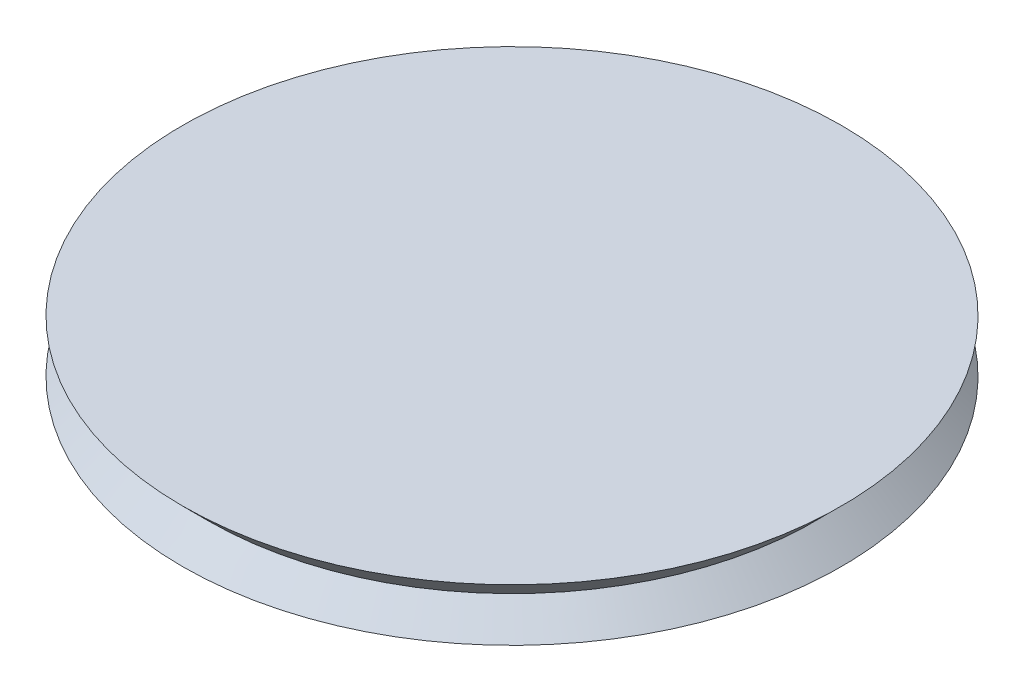
ISO-10303-21;
HEADER;
FILE_DESCRIPTION(('STEP AP214'),'2;1');
FILE_NAME('part.step','',(''),(''),'','','');
FILE_SCHEMA(('AUTOMOTIVE_DESIGN { 1 0 10303 214 1 1 1 1 }'));
ENDSEC;
DATA;
#1=APPLICATION_CONTEXT('core data for automotive mechanical design processes');
#2=APPLICATION_PROTOCOL_DEFINITION('international standard','automotive_design',2000,#1);
#3=PRODUCT_CONTEXT('',#1,'mechanical');
#4=PRODUCT('Part','Part','',(#3));
#5=PRODUCT_RELATED_PRODUCT_CATEGORY('part','',(#4));
#6=PRODUCT_DEFINITION_FORMATION('','',#4);
#7=PRODUCT_DEFINITION_CONTEXT('part definition',#1,'design');
#8=PRODUCT_DEFINITION('design','',#6,#7);
#9=PRODUCT_DEFINITION_SHAPE('','',#8);
#10=(LENGTH_UNIT() NAMED_UNIT(*) SI_UNIT(.MILLI.,.METRE.));
#11=(NAMED_UNIT(*) PLANE_ANGLE_UNIT() SI_UNIT($,.RADIAN.));
#12=(NAMED_UNIT(*) SI_UNIT($,.STERADIAN.) SOLID_ANGLE_UNIT());
#13=UNCERTAINTY_MEASURE_WITH_UNIT(LENGTH_MEASURE(1.E-05),#10,'distance_accuracy_value','');
#14=(GEOMETRIC_REPRESENTATION_CONTEXT(3) GLOBAL_UNCERTAINTY_ASSIGNED_CONTEXT((#13)) GLOBAL_UNIT_ASSIGNED_CONTEXT((#10,
#11,#12)) REPRESENTATION_CONTEXT('',''));
#15=CARTESIAN_POINT('',(0.,0.,0.));
#16=DIRECTION('',(0.,0.,1.));
#17=DIRECTION('',(1.,0.,0.));
#18=AXIS2_PLACEMENT_3D('',#15,#16,#17);
#19=CARTESIAN_POINT('',(0.,7.4,0.));
#20=DIRECTION('',(0.,1.,0.));
#21=DIRECTION('',(0.,0.,1.));
#22=AXIS2_PLACEMENT_3D('',#19,#20,#21);
#23=PLANE('',#22);
#24=CARTESIAN_POINT('',(0.,7.4,0.));
#25=DIRECTION('',(0.,1.,0.));
#26=DIRECTION('',(0.,0.,1.));
#27=AXIS2_PLACEMENT_3D('',#24,#25,#26);
#28=CIRCLE('',#27,7.1);
#29=CARTESIAN_POINT('',(0.,7.4,7.1));
#30=VERTEX_POINT('',#29);
#31=CARTESIAN_POINT('',(0.,7.4,-7.1));
#32=VERTEX_POINT('',#31);
#33=EDGE_CURVE('E304',#30,#32,#28,.T.);
#34=ORIENTED_EDGE('',*,*,#33,.T.);
#35=DIRECTION('',(-1.,0.,0.));
#36=VECTOR('',#35,1.);
#37=CARTESIAN_POINT('',(-6.1,7.4,-7.1));
#38=LINE('',#37,#36);
#39=CARTESIAN_POINT('',(-7.1,7.4,-7.1));
#40=VERTEX_POINT('',#39);
#41=EDGE_CURVE('E255',#32,#40,#38,.T.);
#42=ORIENTED_EDGE('',*,*,#41,.T.);
#43=DIRECTION('',(0.,0.,1.));
#44=VECTOR('',#43,1.);
#45=CARTESIAN_POINT('',(-7.1,7.4,6.1));
#46=LINE('',#45,#44);
#47=CARTESIAN_POINT('',(-7.1,7.4,7.1));
#48=VERTEX_POINT('',#47);
#49=EDGE_CURVE('E260',#40,#48,#46,.T.);
#50=ORIENTED_EDGE('',*,*,#49,.T.);
#51=DIRECTION('',(1.,0.,0.));
#52=VECTOR('',#51,1.);
#53=CARTESIAN_POINT('',(0.,7.4,7.1));
#54=LINE('',#53,#52);
#55=EDGE_CURVE('E114',#48,#30,#54,.T.);
#56=ORIENTED_EDGE('',*,*,#55,.T.);
#57=EDGE_LOOP('',(#34,#42,#50,#56));
#58=FACE_BOUND('',#57,.T.);
#59=CARTESIAN_POINT('',(0.,7.4,0.));
#60=DIRECTION('',(0.,-1.,0.));
#61=DIRECTION('',(0.,0.,-1.));
#62=AXIS2_PLACEMENT_3D('',#59,#60,#61);
#63=CIRCLE('',#62,50.225);
#64=CARTESIAN_POINT('',(0.,7.4,-50.225));
#65=VERTEX_POINT('',#64);
#66=EDGE_CURVE('E209',#65,#65,#63,.T.);
#67=ORIENTED_EDGE('',*,*,#66,.T.);
#68=EDGE_LOOP('',(#67));
#69=FACE_BOUND('',#68,.T.);
#70=ADVANCED_FACE('F41',(#58,#69),#23,.F.);
#71=CARTESIAN_POINT('',(0.,7.4,0.));
#72=DIRECTION('',(0.,-1.,0.));
#73=DIRECTION('',(0.,0.,-1.));
#74=AXIS2_PLACEMENT_3D('',#71,#72,#73);
#75=CYLINDRICAL_SURFACE('',#74,1.6);
#76=CARTESIAN_POINT('',(0.,7.4,0.));
#77=DIRECTION('',(0.,1.,0.));
#78=DIRECTION('',(0.,0.,1.));
#79=AXIS2_PLACEMENT_3D('',#76,#77,#78);
#80=CIRCLE('',#79,1.6);
#81=CARTESIAN_POINT('',(0.,7.4,1.6));
#82=VERTEX_POINT('',#81);
#83=EDGE_CURVE('E202',#82,#82,#80,.T.);
#84=ORIENTED_EDGE('',*,*,#83,.T.);
#85=EDGE_LOOP('',(#84));
#86=FACE_BOUND('',#85,.T.);
#87=CARTESIAN_POINT('',(0.,0.,0.));
#88=DIRECTION('',(0.,1.,0.));
#89=DIRECTION('',(0.,0.,1.));
#90=AXIS2_PLACEMENT_3D('',#87,#88,#89);
#91=CIRCLE('',#90,1.6);
#92=CARTESIAN_POINT('',(0.,0.,1.6));
#93=VERTEX_POINT('',#92);
#94=EDGE_CURVE('E214',#93,#93,#91,.T.);
#95=ORIENTED_EDGE('',*,*,#94,.F.);
#96=EDGE_LOOP('',(#95));
#97=FACE_BOUND('',#96,.T.);
#98=CARTESIAN_POINT('',(-1.1,3.99999999999999,-1.16189500386223));
#99=CARTESIAN_POINT('',(-1.10927031182656,4.03397480461144,-1.15311843130079));
#100=CARTESIAN_POINT('',(-1.11978040861949,4.06718834312701,-1.14295833429883));
#101=CARTESIAN_POINT('',(-1.14266755873094,4.13198047739514,-1.12007705966408));
#102=CARTESIAN_POINT('',(-1.15504094344651,4.1635621255794,-1.10736089851463));
#103=CARTESIAN_POINT('',(-1.1940207421072,4.25568899661757,-1.06571489176433));
#104=CARTESIAN_POINT('',(-1.2225531678548,4.313832380025,-1.03322940633927));
#105=CARTESIAN_POINT('',(-1.28090842097074,4.4230745443434,-0.959928900256689));
#106=CARTESIAN_POINT('',(-1.31072115920425,4.47421852161003,-0.919171996773916));
#107=CARTESIAN_POINT('',(-1.36924824799041,4.56962940814286,-0.829474329978252));
#108=CARTESIAN_POINT('',(-1.39796183632632,4.61389160803624,-0.780528009584058));
#109=CARTESIAN_POINT('',(-1.44961779705837,4.69102760835938,-0.679374813049439));
#110=CARTESIAN_POINT('',(-1.47284446373623,4.7245549833571,-0.627815132803611));
#111=CARTESIAN_POINT('',(-1.51470893289596,4.78387459829417,-0.518712108435694));
#112=CARTESIAN_POINT('',(-1.53335065097024,4.80967344261101,-0.461173930174292));
#113=CARTESIAN_POINT('',(-1.56455961116192,4.85241586073261,-0.340669075193646));
#114=CARTESIAN_POINT('',(-1.57707145356655,4.86927878227095,-0.27765873853739));
#115=CARTESIAN_POINT('',(-1.5943960113471,4.89254379281133,-0.148714517438342));
#116=CARTESIAN_POINT('',(-1.59921656399652,4.89895653048842,-0.0827836794491256));
#117=CARTESIAN_POINT('',(-1.6005059172847,4.90067360291498,0.039587455194473));
#118=CARTESIAN_POINT('',(-1.59809545470662,4.8974685714058,0.0960021495849242));
#119=CARTESIAN_POINT('',(-1.58749994129544,4.88329139695343,0.207283150147398));
#120=CARTESIAN_POINT('',(-1.57931465947015,4.87231894331404,0.262149394290258));
#121=CARTESIAN_POINT('',(-1.55810141552651,4.84357822868422,0.367629711953085));
#122=CARTESIAN_POINT('',(-1.54519038321169,4.82597377958391,0.41831296140437));
#123=CARTESIAN_POINT('',(-1.51540944219095,4.78474359072693,0.515886540372598));
#124=CARTESIAN_POINT('',(-1.49853935735389,4.7611175830779,0.562776701016992));
#125=CARTESIAN_POINT('',(-1.45934977136649,4.70506611099741,0.658261509094108));
#126=CARTESIAN_POINT('',(-1.4366022015524,4.67188369632804,0.706233461367265));
#127=CARTESIAN_POINT('',(-1.38872747445747,4.59960976604622,0.796268532952846));
#128=CARTESIAN_POINT('',(-1.36359587985746,4.56050714741511,0.8383202570274));
#129=CARTESIAN_POINT('',(-1.3073619732146,4.46862280359901,0.924084483108964));
#130=CARTESIAN_POINT('',(-1.27607643854298,4.41467213191052,0.966426158688031));
#131=CARTESIAN_POINT('',(-1.21543810394053,4.299726856543,1.04164639134407));
#132=CARTESIAN_POINT('',(-1.18607963585927,4.23875451133708,1.07455375723116));
#133=CARTESIAN_POINT('',(-1.148381152763,4.14655916680762,1.11422508764565));
#134=CARTESIAN_POINT('',(-1.13758030126083,4.1181285725016,1.12521642122674));
#135=CARTESIAN_POINT('',(-1.11752151157456,4.06000007276428,1.14513945648254));
#136=CARTESIAN_POINT('',(-1.10826504720439,4.03030099036651,1.15406919385151));
#137=CARTESIAN_POINT('',(-1.1,4.00000000000001,1.16189500386223));
#138=B_SPLINE_CURVE_WITH_KNOTS('',3,(#98,#99,#100,#101,#102,#103,#104,#105,#106,#107,#108,#109,
#110,#111,#112,#113,#114,#115,#116,#117,#118,#119,#120,#121,#122,#123,#124,#125,#126,#127,#128,
#129,#130,#131,#132,#133,#134,#135,#136,#137),.UNSPECIFIED.,.F.,.F.,(4,2,2,2,2,2,2,2,2,2,2,2,2,
2,2,2,2,2,2,4),(0.,0.108730962624511,0.217250579592953,0.433599624581697,0.648478132284191,
0.863503045588987,1.05994794301119,1.25622448738958,1.45424361157122,1.65206082898484,
1.82087886528617,1.98970365467538,2.1546060852408,2.31951585341063,2.50666174474359,
2.69416306814262,2.91942233145523,3.14398622771513,3.24089054971267,3.33788682535342),.UNSPECIFIED.);
#139=CARTESIAN_POINT('',(-1.1,3.99999999999999,-1.16189500386223));
#140=VERTEX_POINT('',#139);
#141=CARTESIAN_POINT('',(-1.1,4.00000000000001,1.16189500386223));
#142=VERTEX_POINT('',#141);
#143=EDGE_CURVE('E122',#140,#142,#138,.T.);
#144=ORIENTED_EDGE('',*,*,#143,.F.);
#145=DIRECTION('',(0.,-1.,0.));
#146=VECTOR('',#145,1.);
#147=CARTESIAN_POINT('',(-1.1,7.4,-1.16189500386223));
#148=LINE('',#147,#146);
#149=CARTESIAN_POINT('',(-1.1,3.40000000000001,-1.16189500386223));
#150=VERTEX_POINT('',#149);
#151=EDGE_CURVE('E107',#140,#150,#148,.T.);
#152=ORIENTED_EDGE('',*,*,#151,.T.);
#153=CARTESIAN_POINT('',(-1.1,3.39999999999999,1.16189500386223));
#154=CARTESIAN_POINT('',(-1.10927031182656,3.36602519538854,1.15311843130079));
#155=CARTESIAN_POINT('',(-1.11978040861949,3.33281165687298,1.14295833429883));
#156=CARTESIAN_POINT('',(-1.14266755873094,3.26801952260484,1.12007705966408));
#157=CARTESIAN_POINT('',(-1.15504094344652,3.23643787442059,1.10736089851462));
#158=CARTESIAN_POINT('',(-1.19402074210721,3.14431100338242,1.06571489176433));
#159=CARTESIAN_POINT('',(-1.22255316785481,3.08616761997498,1.03322940633927));
#160=CARTESIAN_POINT('',(-1.28090842097074,2.97692545565658,0.959928900256681));
#161=CARTESIAN_POINT('',(-1.31072115920426,2.92578147838995,0.919171996773906));
#162=CARTESIAN_POINT('',(-1.36924824799042,2.83037059185712,0.829474329978238));
#163=CARTESIAN_POINT('',(-1.39796183632633,2.78610839196374,0.780528009584043));
#164=CARTESIAN_POINT('',(-1.44961779705837,2.7089723916406,0.679374813049422));
#165=CARTESIAN_POINT('',(-1.47284446373623,2.67544501664289,0.627815132803594));
#166=CARTESIAN_POINT('',(-1.51470893289596,2.61612540170582,0.518712108435677));
#167=CARTESIAN_POINT('',(-1.53335065097024,2.59032655738898,0.461173930174275));
#168=CARTESIAN_POINT('',(-1.56455961116193,2.54758413926739,0.340669075193629));
#169=CARTESIAN_POINT('',(-1.57707145356655,2.53072121772905,0.277658738537374));
#170=CARTESIAN_POINT('',(-1.5943960113471,2.50745620718866,0.148714517438326));
#171=CARTESIAN_POINT('',(-1.59921656399652,2.50104346951158,0.0827836794491105));
#172=CARTESIAN_POINT('',(-1.6005059172847,2.49932639708502,-0.0395874551944871));
#173=CARTESIAN_POINT('',(-1.59809545470661,2.5025314285942,-0.0960021495849378));
#174=CARTESIAN_POINT('',(-1.58749994129544,2.51670860304658,-0.207283150147411));
#175=CARTESIAN_POINT('',(-1.57931465947015,2.52768105668596,-0.26214939429027));
#176=CARTESIAN_POINT('',(-1.55810141552651,2.55642177131578,-0.367629711953097));
#177=CARTESIAN_POINT('',(-1.54519038321168,2.57402622041609,-0.418312961404381));
#178=CARTESIAN_POINT('',(-1.51540944219094,2.61525640927308,-0.515886540372609));
#179=CARTESIAN_POINT('',(-1.49853935735388,2.63888241692211,-0.562776701017002));
#180=CARTESIAN_POINT('',(-1.45934977136649,2.6949338890026,-0.658261509094119));
#181=CARTESIAN_POINT('',(-1.4366022015524,2.72811630367197,-0.706233461367276));
#182=CARTESIAN_POINT('',(-1.38872747445746,2.80039023395379,-0.796268532952856));
#183=CARTESIAN_POINT('',(-1.36359587985746,2.8394928525849,-0.83832025702741));
#184=CARTESIAN_POINT('',(-1.30736197321459,2.931377196401,-0.924084483108972));
#185=CARTESIAN_POINT('',(-1.27607643854297,2.9853278680895,-0.966426158688039));
#186=CARTESIAN_POINT('',(-1.21543810394052,3.10027314345702,-1.04164639134407));
#187=CARTESIAN_POINT('',(-1.18607963585926,3.16124548866294,-1.07455375723117));
#188=CARTESIAN_POINT('',(-1.148381152763,3.2534408331924,-1.11422508764565));
#189=CARTESIAN_POINT('',(-1.13758030126082,3.28187142749842,-1.12521642122674));
#190=CARTESIAN_POINT('',(-1.11752151157456,3.33999992723574,-1.14513945648254));
#191=CARTESIAN_POINT('',(-1.10826504720439,3.36969900963351,-1.15406919385151));
#192=CARTESIAN_POINT('',(-1.1,3.40000000000001,-1.16189500386223));
#193=B_SPLINE_CURVE_WITH_KNOTS('',3,(#153,#154,#155,#156,#157,#158,#159,#160,#161,#162,#163,
#164,#165,#166,#167,#168,#169,#170,#171,#172,#173,#174,#175,#176,#177,#178,#179,#180,#181,#182,
#183,#184,#185,#186,#187,#188,#189,#190,#191,#192),.UNSPECIFIED.,.F.,.F.,(4,2,2,2,2,2,2,2,2,2,2,
2,2,2,2,2,2,2,2,4),(0.,0.108730962624511,0.217250579592955,0.433599624581702,0.648478132284199,
0.863503045588998,1.0599479430112,1.25622448738958,1.45424361157123,1.65206082898484,
1.82087886528617,1.98970365467538,2.1546060852408,2.31951585341064,2.50666174474359,
2.69416306814263,2.91942233145524,3.14398622771514,3.24089054971267,3.33788682535342),.UNSPECIFIED.);
#194=CARTESIAN_POINT('',(-1.1,3.39999999999999,1.16189500386223));
#195=VERTEX_POINT('',#194);
#196=EDGE_CURVE('E115',#195,#150,#193,.T.);
#197=ORIENTED_EDGE('',*,*,#196,.F.);
#198=DIRECTION('',(0.,-1.,0.));
#199=VECTOR('',#198,1.);
#200=CARTESIAN_POINT('',(-1.1,7.4,1.16189500386223));
#201=LINE('',#200,#199);
#202=EDGE_CURVE('E128',#195,#142,#201,.F.);
#203=ORIENTED_EDGE('',*,*,#202,.T.);
#204=EDGE_LOOP('',(#144,#152,#197,#203));
#205=FACE_BOUND('',#204,.T.);
#206=ADVANCED_FACE('F127',(#86,#97,#205),#75,.F.);
#207=CARTESIAN_POINT('',(0.,7.4,0.));
#208=DIRECTION('',(0.,-1.,0.));
#209=DIRECTION('',(0.,0.,-1.));
#210=AXIS2_PLACEMENT_3D('',#207,#208,#209);
#211=CYLINDRICAL_SURFACE('',#210,6.1);
#212=DIRECTION('',(0.,-1.,0.));
#213=VECTOR('',#212,1.);
#214=CARTESIAN_POINT('',(0.,7.4,-6.1));
#215=LINE('',#214,#213);
#216=CARTESIAN_POINT('',(0.,6.4,-6.1));
#217=VERTEX_POINT('',#216);
#218=CARTESIAN_POINT('',(0.,0.,-6.1));
#219=VERTEX_POINT('',#218);
#220=EDGE_CURVE('E131',#217,#219,#215,.T.);
#221=ORIENTED_EDGE('',*,*,#220,.F.);
#222=CARTESIAN_POINT('',(0.,6.4,0.));
#223=DIRECTION('',(0.,1.,0.));
#224=DIRECTION('',(0.,0.,1.));
#225=AXIS2_PLACEMENT_3D('',#222,#223,#224);
#226=CIRCLE('',#225,6.1);
#227=CARTESIAN_POINT('',(0.,6.4,6.1));
#228=VERTEX_POINT('',#227);
#229=EDGE_CURVE('E64',#217,#228,#226,.F.);
#230=ORIENTED_EDGE('',*,*,#229,.T.);
#231=DIRECTION('',(0.,-1.,0.));
#232=VECTOR('',#231,1.);
#233=CARTESIAN_POINT('',(0.,7.4,6.1));
#234=LINE('',#233,#232);
#235=CARTESIAN_POINT('',(0.,0.,6.1));
#236=VERTEX_POINT('',#235);
#237=EDGE_CURVE('E230',#228,#236,#234,.T.);
#238=ORIENTED_EDGE('',*,*,#237,.T.);
#239=CARTESIAN_POINT('',(0.,0.,0.));
#240=DIRECTION('',(0.,1.,0.));
#241=DIRECTION('',(0.,0.,1.));
#242=AXIS2_PLACEMENT_3D('',#239,#240,#241);
#243=CIRCLE('',#242,6.1);
#244=EDGE_CURVE('E217',#236,#219,#243,.T.);
#245=ORIENTED_EDGE('',*,*,#244,.T.);
#246=EDGE_LOOP('',(#221,#230,#238,#245));
#247=FACE_BOUND('',#246,.T.);
#248=ADVANCED_FACE('F175',(#247),#211,.T.);
#249=CARTESIAN_POINT('',(0.,7.4,-6.1));
#250=DIRECTION('',(0.,0.,1.));
#251=DIRECTION('',(1.,0.,0.));
#252=AXIS2_PLACEMENT_3D('',#249,#250,#251);
#253=PLANE('',#252);
#254=DIRECTION('',(0.,-1.,0.));
#255=VECTOR('',#254,1.);
#256=CARTESIAN_POINT('',(-6.1,7.4,-6.1));
#257=LINE('',#256,#255);
#258=CARTESIAN_POINT('',(-6.1,6.4,-6.1));
#259=VERTEX_POINT('',#258);
#260=CARTESIAN_POINT('',(-6.1,0.,-6.1));
#261=VERTEX_POINT('',#260);
#262=EDGE_CURVE('E234',#259,#261,#257,.T.);
#263=ORIENTED_EDGE('',*,*,#262,.F.);
#264=DIRECTION('',(-1.,0.,0.));
#265=VECTOR('',#264,1.);
#266=CARTESIAN_POINT('',(0.,6.4,-6.1));
#267=LINE('',#266,#265);
#268=EDGE_CURVE('E240',#259,#217,#267,.F.);
#269=ORIENTED_EDGE('',*,*,#268,.T.);
#270=ORIENTED_EDGE('',*,*,#220,.T.);
#271=DIRECTION('',(-1.,0.,0.));
#272=VECTOR('',#271,1.);
#273=CARTESIAN_POINT('',(0.,0.,-6.1));
#274=LINE('',#273,#272);
#275=EDGE_CURVE('E221',#219,#261,#274,.T.);
#276=ORIENTED_EDGE('',*,*,#275,.T.);
#277=EDGE_LOOP('',(#263,#269,#270,#276));
#278=FACE_BOUND('',#277,.T.);
#279=ADVANCED_FACE('F172',(#278),#253,.F.);
#280=CARTESIAN_POINT('',(-6.1,7.4,0.));
#281=DIRECTION('',(1.,0.,0.));
#282=DIRECTION('',(0.,0.,-1.));
#283=AXIS2_PLACEMENT_3D('',#280,#281,#282);
#284=PLANE('',#283);
#285=CARTESIAN_POINT('',(-6.1,3.7,0.));
#286=DIRECTION('',(-1.,0.,0.));
#287=DIRECTION('',(0.,0.,1.));
#288=AXIS2_PLACEMENT_3D('',#285,#286,#287);
#289=CIRCLE('',#288,1.8);
#290=CARTESIAN_POINT('',(-6.1,3.7,1.8));
#291=VERTEX_POINT('',#290);
#292=EDGE_CURVE('E124',#291,#291,#289,.T.);
#293=ORIENTED_EDGE('',*,*,#292,.F.);
#294=EDGE_LOOP('',(#293));
#295=FACE_BOUND('',#294,.T.);
#296=DIRECTION('',(0.,-1.,0.));
#297=VECTOR('',#296,1.);
#298=CARTESIAN_POINT('',(-6.1,7.4,6.1));
#299=LINE('',#298,#297);
#300=CARTESIAN_POINT('',(-6.1,6.4,6.1));
#301=VERTEX_POINT('',#300);
#302=CARTESIAN_POINT('',(-6.1,0.,6.1));
#303=VERTEX_POINT('',#302);
#304=EDGE_CURVE('E232',#301,#303,#299,.T.);
#305=ORIENTED_EDGE('',*,*,#304,.F.);
#306=DIRECTION('',(0.,0.,1.));
#307=VECTOR('',#306,1.);
#308=CARTESIAN_POINT('',(-6.1,6.4,-6.1));
#309=LINE('',#308,#307);
#310=EDGE_CURVE('E50',#301,#259,#309,.F.);
#311=ORIENTED_EDGE('',*,*,#310,.T.);
#312=ORIENTED_EDGE('',*,*,#262,.T.);
#313=DIRECTION('',(0.,0.,1.));
#314=VECTOR('',#313,1.);
#315=CARTESIAN_POINT('',(-6.1,0.,0.));
#316=LINE('',#315,#314);
#317=EDGE_CURVE('E224',#261,#303,#316,.T.);
#318=ORIENTED_EDGE('',*,*,#317,.T.);
#319=EDGE_LOOP('',(#305,#311,#312,#318));
#320=FACE_BOUND('',#319,.T.);
#321=ADVANCED_FACE('F169',(#295,#320),#284,.F.);
#322=CARTESIAN_POINT('',(0.,7.4,6.1));
#323=DIRECTION('',(0.,0.,-1.));
#324=DIRECTION('',(-1.,0.,0.));
#325=AXIS2_PLACEMENT_3D('',#322,#323,#324);
#326=PLANE('',#325);
#327=ORIENTED_EDGE('',*,*,#237,.F.);
#328=DIRECTION('',(1.,0.,0.));
#329=VECTOR('',#328,1.);
#330=CARTESIAN_POINT('',(-6.1,6.4,6.1));
#331=LINE('',#330,#329);
#332=EDGE_CURVE('E11',#228,#301,#331,.F.);
#333=ORIENTED_EDGE('',*,*,#332,.T.);
#334=ORIENTED_EDGE('',*,*,#304,.T.);
#335=DIRECTION('',(1.,0.,0.));
#336=VECTOR('',#335,1.);
#337=CARTESIAN_POINT('',(0.,0.,6.1));
#338=LINE('',#337,#336);
#339=EDGE_CURVE('E227',#303,#236,#338,.T.);
#340=ORIENTED_EDGE('',*,*,#339,.T.);
#341=EDGE_LOOP('',(#327,#333,#334,#340));
#342=FACE_BOUND('',#341,.T.);
#343=ADVANCED_FACE('F165',(#342),#326,.F.);
#344=CARTESIAN_POINT('',(0.,0.,0.));
#345=DIRECTION('',(0.,1.,0.));
#346=DIRECTION('',(0.,0.,1.));
#347=AXIS2_PLACEMENT_3D('',#344,#345,#346);
#348=PLANE('',#347);
#349=ORIENTED_EDGE('',*,*,#94,.T.);
#350=EDGE_LOOP('',(#349));
#351=FACE_BOUND('',#350,.T.);
#352=ORIENTED_EDGE('',*,*,#244,.F.);
#353=ORIENTED_EDGE('',*,*,#339,.F.);
#354=ORIENTED_EDGE('',*,*,#317,.F.);
#355=ORIENTED_EDGE('',*,*,#275,.F.);
#356=EDGE_LOOP('',(#352,#353,#354,#355));
#357=FACE_BOUND('',#356,.T.);
#358=ADVANCED_FACE('F161',(#351,#357),#348,.F.);
#359=CARTESIAN_POINT('',(-2.1,3.7,0.));
#360=DIRECTION('',(-1.,0.,0.));
#361=DIRECTION('',(0.,0.,1.));
#362=AXIS2_PLACEMENT_3D('',#359,#360,#361);
#363=CYLINDRICAL_SURFACE('',#362,1.8);
#364=CARTESIAN_POINT('',(-2.1,3.7,0.));
#365=DIRECTION('',(-1.,0.,0.));
#366=DIRECTION('',(0.,0.,1.));
#367=AXIS2_PLACEMENT_3D('',#364,#365,#366);
#368=CIRCLE('',#367,1.8);
#369=CARTESIAN_POINT('',(-2.1,3.7,1.8));
#370=VERTEX_POINT('',#369);
#371=EDGE_CURVE('E218',#370,#370,#368,.T.);
#372=ORIENTED_EDGE('',*,*,#371,.F.);
#373=EDGE_LOOP('',(#372));
#374=FACE_BOUND('',#373,.T.);
#375=ORIENTED_EDGE('',*,*,#292,.T.);
#376=EDGE_LOOP('',(#375));
#377=FACE_BOUND('',#376,.T.);
#378=ADVANCED_FACE('F157',(#374,#377),#363,.F.);
#379=CARTESIAN_POINT('',(-2.1,3.7,0.));
#380=DIRECTION('',(-1.,0.,0.));
#381=DIRECTION('',(0.,0.,1.));
#382=AXIS2_PLACEMENT_3D('',#379,#380,#381);
#383=PLANE('',#382);
#384=CARTESIAN_POINT('',(-2.1,3.7,0.));
#385=DIRECTION('',(-1.,0.,0.));
#386=DIRECTION('',(0.,0.,1.));
#387=AXIS2_PLACEMENT_3D('',#384,#385,#386);
#388=CIRCLE('',#387,1.2);
#389=CARTESIAN_POINT('',(-2.1,3.7,1.2));
#390=VERTEX_POINT('',#389);
#391=EDGE_CURVE('E203',#390,#390,#388,.T.);
#392=ORIENTED_EDGE('',*,*,#391,.F.);
#393=EDGE_LOOP('',(#392));
#394=FACE_BOUND('',#393,.T.);
#395=ORIENTED_EDGE('',*,*,#371,.T.);
#396=EDGE_LOOP('',(#395));
#397=FACE_BOUND('',#396,.T.);
#398=ADVANCED_FACE('F153',(#394,#397),#383,.T.);
#399=CARTESIAN_POINT('',(-1.1,3.7,0.));
#400=DIRECTION('',(-1.,0.,0.));
#401=DIRECTION('',(0.,0.,1.));
#402=AXIS2_PLACEMENT_3D('',#399,#400,#401);
#403=PLANE('',#402);
#404=CARTESIAN_POINT('',(-1.1,3.7,0.));
#405=DIRECTION('',(-1.,0.,0.));
#406=DIRECTION('',(0.,0.,1.));
#407=AXIS2_PLACEMENT_3D('',#404,#405,#406);
#408=CIRCLE('',#407,1.2);
#409=EDGE_CURVE('E110',#140,#150,#408,.T.);
#410=ORIENTED_EDGE('',*,*,#409,.T.);
#411=ORIENTED_EDGE('',*,*,#151,.F.);
#412=EDGE_LOOP('',(#410,#411));
#413=FACE_BOUND('',#412,.T.);
#414=ADVANCED_FACE('F109',(#413),#403,.T.);
#415=CARTESIAN_POINT('',(-1.1,3.7,0.));
#416=DIRECTION('',(-1.,0.,0.));
#417=DIRECTION('',(0.,0.,1.));
#418=AXIS2_PLACEMENT_3D('',#415,#416,#417);
#419=CYLINDRICAL_SURFACE('',#418,1.2);
#420=ORIENTED_EDGE('',*,*,#196,.T.);
#421=ORIENTED_EDGE('',*,*,#409,.F.);
#422=ORIENTED_EDGE('',*,*,#143,.T.);
#423=EDGE_CURVE('E125',#195,#142,#408,.T.);
#424=ORIENTED_EDGE('',*,*,#423,.F.);
#425=EDGE_LOOP('',(#420,#421,#422,#424));
#426=FACE_BOUND('',#425,.T.);
#427=ORIENTED_EDGE('',*,*,#391,.T.);
#428=EDGE_LOOP('',(#427));
#429=FACE_BOUND('',#428,.T.);
#430=ADVANCED_FACE('F119',(#426,#429),#419,.F.);
#431=ORIENTED_EDGE('',*,*,#423,.T.);
#432=ORIENTED_EDGE('',*,*,#202,.F.);
#433=EDGE_LOOP('',(#431,#432));
#434=FACE_BOUND('',#433,.T.);
#435=ADVANCED_FACE('F151',(#434),#403,.T.);
#436=ORIENTED_EDGE('',*,*,#83,.F.);
#437=EDGE_LOOP('',(#436));
#438=FACE_BOUND('',#437,.T.);
#439=ADVANCED_FACE('F184',(#438),#23,.F.);
#440=CARTESIAN_POINT('',(0.,11.4,0.));
#441=DIRECTION('',(0.,1.,0.));
#442=DIRECTION('',(0.,0.,1.));
#443=AXIS2_PLACEMENT_3D('',#440,#441,#442);
#444=CONICAL_SURFACE('',#443,46.225,0.785398163397449);
#445=CARTESIAN_POINT('',(0.,15.4,0.));
#446=DIRECTION('',(0.,-1.,0.));
#447=DIRECTION('',(0.,0.,-1.));
#448=AXIS2_PLACEMENT_3D('',#445,#446,#447);
#449=CIRCLE('',#448,50.225);
#450=CARTESIAN_POINT('',(0.,15.4,-50.225));
#451=VERTEX_POINT('',#450);
#452=EDGE_CURVE('E204',#451,#451,#449,.T.);
#453=ORIENTED_EDGE('',*,*,#452,.T.);
#454=EDGE_LOOP('',(#453));
#455=FACE_BOUND('',#454,.T.);
#456=CARTESIAN_POINT('',(0.,11.4,0.));
#457=DIRECTION('',(0.,-1.,0.));
#458=DIRECTION('',(0.,0.,-1.));
#459=AXIS2_PLACEMENT_3D('',#456,#457,#458);
#460=CIRCLE('',#459,46.225);
#461=CARTESIAN_POINT('',(0.,11.4,-46.225));
#462=VERTEX_POINT('',#461);
#463=EDGE_CURVE('E267',#462,#462,#460,.T.);
#464=ORIENTED_EDGE('',*,*,#463,.F.);
#465=EDGE_LOOP('',(#464));
#466=FACE_BOUND('',#465,.T.);
#467=ADVANCED_FACE('F190',(#455,#466),#444,.T.);
#468=CARTESIAN_POINT('',(0.,7.4,0.));
#469=DIRECTION('',(0.,-1.,0.));
#470=DIRECTION('',(0.,0.,-1.));
#471=AXIS2_PLACEMENT_3D('',#468,#469,#470);
#472=CONICAL_SURFACE('',#471,50.225,0.785398163397449);
#473=ORIENTED_EDGE('',*,*,#463,.T.);
#474=EDGE_LOOP('',(#473));
#475=FACE_BOUND('',#474,.T.);
#476=ORIENTED_EDGE('',*,*,#66,.F.);
#477=EDGE_LOOP('',(#476));
#478=FACE_BOUND('',#477,.T.);
#479=ADVANCED_FACE('F196',(#475,#478),#472,.T.);
#480=CARTESIAN_POINT('',(0.,15.4,0.));
#481=DIRECTION('',(0.,1.,0.));
#482=DIRECTION('',(0.,0.,1.));
#483=AXIS2_PLACEMENT_3D('',#480,#481,#482);
#484=PLANE('',#483);
#485=ORIENTED_EDGE('',*,*,#452,.F.);
#486=EDGE_LOOP('',(#485));
#487=FACE_BOUND('',#486,.T.);
#488=ADVANCED_FACE('F286',(#487),#484,.T.);
#489=CARTESIAN_POINT('',(0.,6.4,7.1));
#490=DIRECTION('',(-1.,0.,0.));
#491=DIRECTION('',(0.,0.,1.));
#492=AXIS2_PLACEMENT_3D('',#489,#490,#491);
#493=CYLINDRICAL_SURFACE('',#492,1.);
#494=CARTESIAN_POINT('',(-7.1,6.4,7.1));
#495=DIRECTION('',(-0.707106781186548,0.,-0.707106781186547));
#496=DIRECTION('',(-0.707106781186547,0.,0.707106781186548));
#497=AXIS2_PLACEMENT_3D('',#494,#495,#496);
#498=ELLIPSE('',#497,1.41421356237309,1.);
#499=EDGE_CURVE('E263',#301,#48,#498,.F.);
#500=ORIENTED_EDGE('',*,*,#499,.F.);
#501=ORIENTED_EDGE('',*,*,#332,.F.);
#502=CARTESIAN_POINT('',(0.,6.4,7.1));
#503=DIRECTION('',(-1.,0.,0.));
#504=DIRECTION('',(0.,0.,1.));
#505=AXIS2_PLACEMENT_3D('',#502,#503,#504);
#506=CIRCLE('',#505,1.);
#507=EDGE_CURVE('E45',#30,#228,#506,.T.);
#508=ORIENTED_EDGE('',*,*,#507,.F.);
#509=ORIENTED_EDGE('',*,*,#55,.F.);
#510=EDGE_LOOP('',(#500,#501,#508,#509));
#511=FACE_BOUND('',#510,.T.);
#512=ADVANCED_FACE('F43',(#511),#493,.F.);
#513=CARTESIAN_POINT('',(0.,6.4,0.));
#514=DIRECTION('',(0.,1.,0.));
#515=DIRECTION('',(0.,0.,1.));
#516=AXIS2_PLACEMENT_3D('',#513,#514,#515);
#517=TOROIDAL_SURFACE('',#516,7.1,1.);
#518=ORIENTED_EDGE('',*,*,#507,.T.);
#519=ORIENTED_EDGE('',*,*,#229,.F.);
#520=CARTESIAN_POINT('',(0.,6.4,-7.1));
#521=DIRECTION('',(1.,0.,0.));
#522=DIRECTION('',(0.,0.,-1.));
#523=AXIS2_PLACEMENT_3D('',#520,#521,#522);
#524=CIRCLE('',#523,1.);
#525=EDGE_CURVE('E254',#32,#217,#524,.T.);
#526=ORIENTED_EDGE('',*,*,#525,.F.);
#527=ORIENTED_EDGE('',*,*,#33,.F.);
#528=EDGE_LOOP('',(#518,#519,#526,#527));
#529=FACE_BOUND('',#528,.T.);
#530=ADVANCED_FACE('F295',(#529),#517,.F.);
#531=CARTESIAN_POINT('',(-7.1,6.4,0.));
#532=DIRECTION('',(0.,0.,-1.));
#533=DIRECTION('',(-1.,0.,0.));
#534=AXIS2_PLACEMENT_3D('',#531,#532,#533);
#535=CYLINDRICAL_SURFACE('',#534,1.);
#536=ORIENTED_EDGE('',*,*,#499,.T.);
#537=ORIENTED_EDGE('',*,*,#49,.F.);
#538=CARTESIAN_POINT('',(-7.1,6.4,-7.1));
#539=DIRECTION('',(0.707106781186547,0.,-0.707106781186547));
#540=DIRECTION('',(-0.707106781186547,0.,-0.707106781186547));
#541=AXIS2_PLACEMENT_3D('',#538,#539,#540);
#542=ELLIPSE('',#541,1.4142135623731,1.);
#543=EDGE_CURVE('E251',#259,#40,#542,.F.);
#544=ORIENTED_EDGE('',*,*,#543,.F.);
#545=ORIENTED_EDGE('',*,*,#310,.F.);
#546=EDGE_LOOP('',(#536,#537,#544,#545));
#547=FACE_BOUND('',#546,.T.);
#548=ADVANCED_FACE('F259',(#547),#535,.F.);
#549=CARTESIAN_POINT('',(0.,6.4,-7.1));
#550=DIRECTION('',(1.,0.,0.));
#551=DIRECTION('',(0.,0.,-1.));
#552=AXIS2_PLACEMENT_3D('',#549,#550,#551);
#553=CYLINDRICAL_SURFACE('',#552,1.);
#554=ORIENTED_EDGE('',*,*,#525,.T.);
#555=ORIENTED_EDGE('',*,*,#268,.F.);
#556=ORIENTED_EDGE('',*,*,#543,.T.);
#557=ORIENTED_EDGE('',*,*,#41,.F.);
#558=EDGE_LOOP('',(#554,#555,#556,#557));
#559=FACE_BOUND('',#558,.T.);
#560=ADVANCED_FACE('F249',(#559),#553,.F.);
#561=CLOSED_SHELL('',(#70,#206,#248,#279,#321,#343,#358,#378,#398,#414,#430,#435,#439,#467,#479,
#488,#512,#530,#548,#560));
#562=MANIFOLD_SOLID_BREP('B2',#561);
#563=ADVANCED_BREP_SHAPE_REPRESENTATION('',(#18,#562),#14);
#564=SHAPE_DEFINITION_REPRESENTATION(#9,#563);
ENDSEC;
END-ISO-10303-21;
